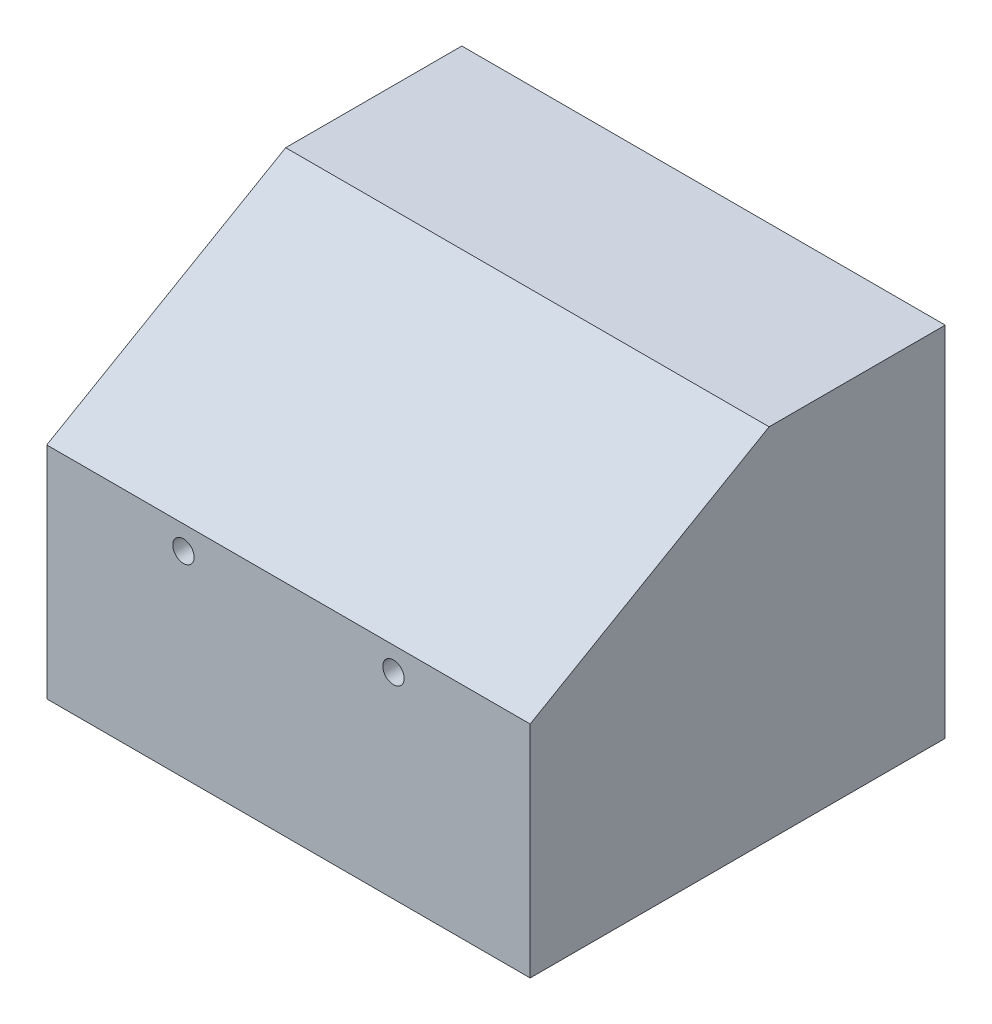
ISO-10303-21;
HEADER;
FILE_DESCRIPTION(('STEP AP214'),'2;1');
FILE_NAME('part.step','',(''),(''),'','','');
FILE_SCHEMA(('AUTOMOTIVE_DESIGN { 1 0 10303 214 1 1 1 1 }'));
ENDSEC;
DATA;
#1=APPLICATION_CONTEXT('core data for automotive mechanical design processes');
#2=APPLICATION_PROTOCOL_DEFINITION('international standard','automotive_design',2000,#1);
#3=PRODUCT_CONTEXT('',#1,'mechanical');
#4=PRODUCT('Part','Part','',(#3));
#5=PRODUCT_RELATED_PRODUCT_CATEGORY('part','',(#4));
#6=PRODUCT_DEFINITION_FORMATION('','',#4);
#7=PRODUCT_DEFINITION_CONTEXT('part definition',#1,'design');
#8=PRODUCT_DEFINITION('design','',#6,#7);
#9=PRODUCT_DEFINITION_SHAPE('','',#8);
#10=(LENGTH_UNIT() NAMED_UNIT(*) SI_UNIT(.MILLI.,.METRE.));
#11=(NAMED_UNIT(*) PLANE_ANGLE_UNIT() SI_UNIT($,.RADIAN.));
#12=(NAMED_UNIT(*) SI_UNIT($,.STERADIAN.) SOLID_ANGLE_UNIT());
#13=UNCERTAINTY_MEASURE_WITH_UNIT(LENGTH_MEASURE(1.E-05),#10,'distance_accuracy_value','');
#14=(GEOMETRIC_REPRESENTATION_CONTEXT(3) GLOBAL_UNCERTAINTY_ASSIGNED_CONTEXT((#13)) GLOBAL_UNIT_ASSIGNED_CONTEXT((#10,
#11,#12)) REPRESENTATION_CONTEXT('',''));
#15=CARTESIAN_POINT('',(0.,0.,0.));
#16=DIRECTION('',(0.,0.,1.));
#17=DIRECTION('',(1.,0.,0.));
#18=AXIS2_PLACEMENT_3D('',#15,#16,#17);
#19=CARTESIAN_POINT('',(-97.25,-72.,167.));
#20=DIRECTION('',(1.,0.,0.));
#21=DIRECTION('',(0.,0.,-1.));
#22=AXIS2_PLACEMENT_3D('',#19,#20,#21);
#23=PLANE('',#22);
#24=DIRECTION('',(0.,-1.,0.));
#25=VECTOR('',#24,1.);
#26=CARTESIAN_POINT('',(-97.25,-72.,167.));
#27=LINE('',#26,#25);
#28=CARTESIAN_POINT('',(-97.25,16.5000000000005,167.));
#29=VERTEX_POINT('',#28);
#30=CARTESIAN_POINT('',(-97.25,-72.,167.));
#31=VERTEX_POINT('',#30);
#32=EDGE_CURVE('E93',#29,#31,#27,.T.);
#33=ORIENTED_EDGE('',*,*,#32,.F.);
#34=DIRECTION('',(0.,-0.499999999999995,0.866025403784442));
#35=VECTOR('',#34,1.);
#36=CARTESIAN_POINT('',(-97.25,72.,70.871180179927));
#37=LINE('',#36,#35);
#38=CARTESIAN_POINT('',(-97.25,72.,70.871180179927));
#39=VERTEX_POINT('',#38);
#40=EDGE_CURVE('E46',#39,#29,#37,.T.);
#41=ORIENTED_EDGE('',*,*,#40,.F.);
#42=DIRECTION('',(0.,0.,-1.));
#43=VECTOR('',#42,1.);
#44=CARTESIAN_POINT('',(-97.25,72.,167.));
#45=LINE('',#44,#43);
#46=CARTESIAN_POINT('',(-97.25,72.,0.));
#47=VERTEX_POINT('',#46);
#48=EDGE_CURVE('E74',#39,#47,#45,.T.);
#49=ORIENTED_EDGE('',*,*,#48,.T.);
#50=DIRECTION('',(0.,-1.,0.));
#51=VECTOR('',#50,1.);
#52=CARTESIAN_POINT('',(-97.25,-72.,0.));
#53=LINE('',#52,#51);
#54=CARTESIAN_POINT('',(-97.25,-72.,0.));
#55=VERTEX_POINT('',#54);
#56=EDGE_CURVE('E79',#47,#55,#53,.T.);
#57=ORIENTED_EDGE('',*,*,#56,.T.);
#58=DIRECTION('',(0.,0.,-1.));
#59=VECTOR('',#58,1.);
#60=CARTESIAN_POINT('',(-97.25,-72.,167.));
#61=LINE('',#60,#59);
#62=EDGE_CURVE('E11',#31,#55,#61,.T.);
#63=ORIENTED_EDGE('',*,*,#62,.F.);
#64=EDGE_LOOP('',(#33,#41,#49,#57,#63));
#65=FACE_BOUND('',#64,.T.);
#66=ADVANCED_FACE('F32',(#65),#23,.F.);
#67=CARTESIAN_POINT('',(97.25,-72.,167.));
#68=DIRECTION('',(0.,1.,0.));
#69=DIRECTION('',(-1.,0.,0.));
#70=AXIS2_PLACEMENT_3D('',#67,#68,#69);
#71=PLANE('',#70);
#72=DIRECTION('',(1.,0.,0.));
#73=VECTOR('',#72,1.);
#74=CARTESIAN_POINT('',(97.25,-72.,0.));
#75=LINE('',#74,#73);
#76=CARTESIAN_POINT('',(97.25,-72.,0.));
#77=VERTEX_POINT('',#76);
#78=EDGE_CURVE('E97',#55,#77,#75,.T.);
#79=ORIENTED_EDGE('',*,*,#78,.T.);
#80=DIRECTION('',(0.,0.,-1.));
#81=VECTOR('',#80,1.);
#82=CARTESIAN_POINT('',(97.25,-72.,167.));
#83=LINE('',#82,#81);
#84=CARTESIAN_POINT('',(97.25,-72.,167.));
#85=VERTEX_POINT('',#84);
#86=EDGE_CURVE('E39',#85,#77,#83,.T.);
#87=ORIENTED_EDGE('',*,*,#86,.F.);
#88=DIRECTION('',(1.,0.,0.));
#89=VECTOR('',#88,1.);
#90=CARTESIAN_POINT('',(97.25,-72.,167.));
#91=LINE('',#90,#89);
#92=EDGE_CURVE('E55',#31,#85,#91,.T.);
#93=ORIENTED_EDGE('',*,*,#92,.F.);
#94=ORIENTED_EDGE('',*,*,#62,.T.);
#95=EDGE_LOOP('',(#79,#87,#93,#94));
#96=FACE_BOUND('',#95,.T.);
#97=ADVANCED_FACE('F114',(#96),#71,.F.);
#98=CARTESIAN_POINT('',(97.25,-72.,167.));
#99=DIRECTION('',(-1.,0.,0.));
#100=DIRECTION('',(0.,0.,1.));
#101=AXIS2_PLACEMENT_3D('',#98,#99,#100);
#102=PLANE('',#101);
#103=DIRECTION('',(0.,0.,-1.));
#104=VECTOR('',#103,1.);
#105=CARTESIAN_POINT('',(97.25,72.,167.));
#106=LINE('',#105,#104);
#107=CARTESIAN_POINT('',(97.25,72.,70.871180179927));
#108=VERTEX_POINT('',#107);
#109=CARTESIAN_POINT('',(97.25,72.,0.));
#110=VERTEX_POINT('',#109);
#111=EDGE_CURVE('E83',#108,#110,#106,.T.);
#112=ORIENTED_EDGE('',*,*,#111,.F.);
#113=DIRECTION('',(0.,-0.499999999999995,0.866025403784442));
#114=VECTOR('',#113,1.);
#115=CARTESIAN_POINT('',(97.25,72.,70.871180179927));
#116=LINE('',#115,#114);
#117=CARTESIAN_POINT('',(97.25,16.5000000000005,167.));
#118=VERTEX_POINT('',#117);
#119=EDGE_CURVE('E140',#108,#118,#116,.T.);
#120=ORIENTED_EDGE('',*,*,#119,.T.);
#121=DIRECTION('',(0.,1.,0.));
#122=VECTOR('',#121,1.);
#123=CARTESIAN_POINT('',(97.25,-72.,167.));
#124=LINE('',#123,#122);
#125=EDGE_CURVE('E84',#85,#118,#124,.T.);
#126=ORIENTED_EDGE('',*,*,#125,.F.);
#127=ORIENTED_EDGE('',*,*,#86,.T.);
#128=DIRECTION('',(0.,1.,0.));
#129=VECTOR('',#128,1.);
#130=CARTESIAN_POINT('',(97.25,-72.,0.));
#131=LINE('',#130,#129);
#132=EDGE_CURVE('E94',#77,#110,#131,.T.);
#133=ORIENTED_EDGE('',*,*,#132,.T.);
#134=EDGE_LOOP('',(#112,#120,#126,#127,#133));
#135=FACE_BOUND('',#134,.T.);
#136=ADVANCED_FACE('F111',(#135),#102,.F.);
#137=CARTESIAN_POINT('',(97.25,72.,167.));
#138=DIRECTION('',(0.,-1.,0.));
#139=DIRECTION('',(1.,0.,0.));
#140=AXIS2_PLACEMENT_3D('',#137,#138,#139);
#141=PLANE('',#140);
#142=ORIENTED_EDGE('',*,*,#48,.F.);
#143=DIRECTION('',(-1.,0.,0.));
#144=VECTOR('',#143,1.);
#145=CARTESIAN_POINT('',(97.25,72.,70.871180179927));
#146=LINE('',#145,#144);
#147=EDGE_CURVE('E138',#108,#39,#146,.T.);
#148=ORIENTED_EDGE('',*,*,#147,.F.);
#149=ORIENTED_EDGE('',*,*,#111,.T.);
#150=DIRECTION('',(-1.,0.,0.));
#151=VECTOR('',#150,1.);
#152=CARTESIAN_POINT('',(97.25,72.,0.));
#153=LINE('',#152,#151);
#154=EDGE_CURVE('E87',#110,#47,#153,.T.);
#155=ORIENTED_EDGE('',*,*,#154,.T.);
#156=EDGE_LOOP('',(#142,#148,#149,#155));
#157=FACE_BOUND('',#156,.T.);
#158=ADVANCED_FACE('F88',(#157),#141,.F.);
#159=CARTESIAN_POINT('',(0.,0.,167.));
#160=DIRECTION('',(0.,0.,1.));
#161=DIRECTION('',(1.,0.,0.));
#162=AXIS2_PLACEMENT_3D('',#159,#160,#161);
#163=PLANE('',#162);
#164=DIRECTION('',(-1.,0.,0.));
#165=VECTOR('',#164,1.);
#166=CARTESIAN_POINT('',(97.25,16.5000000000005,167.));
#167=LINE('',#166,#165);
#168=EDGE_CURVE('E137',#118,#29,#167,.T.);
#169=ORIENTED_EDGE('',*,*,#168,.T.);
#170=ORIENTED_EDGE('',*,*,#32,.T.);
#171=ORIENTED_EDGE('',*,*,#92,.T.);
#172=ORIENTED_EDGE('',*,*,#125,.T.);
#173=EDGE_LOOP('',(#169,#170,#171,#172));
#174=FACE_BOUND('',#173,.T.);
#175=CARTESIAN_POINT('',(42.25,7.00000000000001,167.));
#176=DIRECTION('',(0.,0.,1.));
#177=DIRECTION('',(1.,0.,0.));
#178=AXIS2_PLACEMENT_3D('',#175,#176,#177);
#179=CIRCLE('',#178,4.29999999999999);
#180=CARTESIAN_POINT('',(46.55,7.00000000000001,167.));
#181=VERTEX_POINT('',#180);
#182=EDGE_CURVE('E134',#181,#181,#179,.T.);
#183=ORIENTED_EDGE('',*,*,#182,.F.);
#184=EDGE_LOOP('',(#183));
#185=FACE_BOUND('',#184,.T.);
#186=CARTESIAN_POINT('',(-42.25,7.00000000000001,167.));
#187=DIRECTION('',(0.,0.,1.));
#188=DIRECTION('',(1.,0.,0.));
#189=AXIS2_PLACEMENT_3D('',#186,#187,#188);
#190=CIRCLE('',#189,4.29999999999999);
#191=CARTESIAN_POINT('',(-37.95,7.00000000000001,167.));
#192=VERTEX_POINT('',#191);
#193=EDGE_CURVE('E122',#192,#192,#190,.T.);
#194=ORIENTED_EDGE('',*,*,#193,.F.);
#195=EDGE_LOOP('',(#194));
#196=FACE_BOUND('',#195,.T.);
#197=ADVANCED_FACE('F146',(#174,#185,#196),#163,.T.);
#198=CARTESIAN_POINT('',(0.,0.,0.));
#199=DIRECTION('',(0.,0.,1.));
#200=DIRECTION('',(1.,0.,0.));
#201=AXIS2_PLACEMENT_3D('',#198,#199,#200);
#202=PLANE('',#201);
#203=CARTESIAN_POINT('',(42.25,7.00000000000001,0.));
#204=DIRECTION('',(0.,0.,1.));
#205=DIRECTION('',(1.,0.,0.));
#206=AXIS2_PLACEMENT_3D('',#203,#204,#205);
#207=CIRCLE('',#206,2.24999999999997);
#208=CARTESIAN_POINT('',(44.5,7.00000000000001,0.));
#209=VERTEX_POINT('',#208);
#210=EDGE_CURVE('E125',#209,#209,#207,.T.);
#211=ORIENTED_EDGE('',*,*,#210,.T.);
#212=EDGE_LOOP('',(#211));
#213=FACE_BOUND('',#212,.T.);
#214=CARTESIAN_POINT('',(-42.25,7.00000000000001,0.));
#215=DIRECTION('',(0.,0.,1.));
#216=DIRECTION('',(1.,0.,0.));
#217=AXIS2_PLACEMENT_3D('',#214,#215,#216);
#218=CIRCLE('',#217,2.24999999999997);
#219=CARTESIAN_POINT('',(-40.,7.00000000000001,0.));
#220=VERTEX_POINT('',#219);
#221=EDGE_CURVE('E98',#220,#220,#218,.T.);
#222=ORIENTED_EDGE('',*,*,#221,.T.);
#223=EDGE_LOOP('',(#222));
#224=FACE_BOUND('',#223,.T.);
#225=ORIENTED_EDGE('',*,*,#56,.F.);
#226=ORIENTED_EDGE('',*,*,#154,.F.);
#227=ORIENTED_EDGE('',*,*,#132,.F.);
#228=ORIENTED_EDGE('',*,*,#78,.F.);
#229=EDGE_LOOP('',(#225,#226,#227,#228));
#230=FACE_BOUND('',#229,.T.);
#231=ADVANCED_FACE('F96',(#213,#224,#230),#202,.F.);
#232=CARTESIAN_POINT('',(-42.25,7.00000000000001,167.));
#233=DIRECTION('',(0.,0.,1.));
#234=DIRECTION('',(1.,0.,0.));
#235=AXIS2_PLACEMENT_3D('',#232,#233,#234);
#236=CYLINDRICAL_SURFACE('',#235,2.24999999999997);
#237=ORIENTED_EDGE('',*,*,#221,.F.);
#238=EDGE_LOOP('',(#237));
#239=FACE_BOUND('',#238,.T.);
#240=CARTESIAN_POINT('',(-42.25,7.00000000000001,5.));
#241=DIRECTION('',(0.,0.,1.));
#242=DIRECTION('',(1.,0.,0.));
#243=AXIS2_PLACEMENT_3D('',#240,#241,#242);
#244=CIRCLE('',#243,2.24999999999997);
#245=CARTESIAN_POINT('',(-40.,7.00000000000001,5.));
#246=VERTEX_POINT('',#245);
#247=EDGE_CURVE('E102',#246,#246,#244,.T.);
#248=ORIENTED_EDGE('',*,*,#247,.T.);
#249=EDGE_LOOP('',(#248));
#250=FACE_BOUND('',#249,.T.);
#251=ADVANCED_FACE('F171',(#239,#250),#236,.F.);
#252=CARTESIAN_POINT('',(-40.,7.00000000000001,5.));
#253=DIRECTION('',(0.,0.,-1.));
#254=DIRECTION('',(-1.,0.,0.));
#255=AXIS2_PLACEMENT_3D('',#252,#253,#254);
#256=PLANE('',#255);
#257=ORIENTED_EDGE('',*,*,#247,.F.);
#258=EDGE_LOOP('',(#257));
#259=FACE_BOUND('',#258,.T.);
#260=CARTESIAN_POINT('',(-42.25,7.00000000000001,5.));
#261=DIRECTION('',(0.,0.,1.));
#262=DIRECTION('',(1.,0.,0.));
#263=AXIS2_PLACEMENT_3D('',#260,#261,#262);
#264=CIRCLE('',#263,4.29999999999996);
#265=CARTESIAN_POINT('',(-37.95,7.00000000000001,5.));
#266=VERTEX_POINT('',#265);
#267=EDGE_CURVE('E119',#266,#266,#264,.T.);
#268=ORIENTED_EDGE('',*,*,#267,.T.);
#269=EDGE_LOOP('',(#268));
#270=FACE_BOUND('',#269,.T.);
#271=ADVANCED_FACE('F177',(#259,#270),#256,.F.);
#272=CARTESIAN_POINT('',(-42.25,7.00000000000001,167.));
#273=DIRECTION('',(0.,0.,1.));
#274=DIRECTION('',(1.,0.,0.));
#275=AXIS2_PLACEMENT_3D('',#272,#273,#274);
#276=CYLINDRICAL_SURFACE('',#275,4.29999999999997);
#277=ORIENTED_EDGE('',*,*,#267,.F.);
#278=EDGE_LOOP('',(#277));
#279=FACE_BOUND('',#278,.T.);
#280=ORIENTED_EDGE('',*,*,#193,.T.);
#281=EDGE_LOOP('',(#280));
#282=FACE_BOUND('',#281,.T.);
#283=ADVANCED_FACE('F181',(#279,#282),#276,.F.);
#284=CARTESIAN_POINT('',(42.25,7.00000000000001,167.));
#285=DIRECTION('',(0.,0.,1.));
#286=DIRECTION('',(1.,0.,0.));
#287=AXIS2_PLACEMENT_3D('',#284,#285,#286);
#288=CYLINDRICAL_SURFACE('',#287,2.24999999999997);
#289=ORIENTED_EDGE('',*,*,#210,.F.);
#290=EDGE_LOOP('',(#289));
#291=FACE_BOUND('',#290,.T.);
#292=CARTESIAN_POINT('',(42.25,7.00000000000001,5.));
#293=DIRECTION('',(0.,0.,1.));
#294=DIRECTION('',(1.,0.,0.));
#295=AXIS2_PLACEMENT_3D('',#292,#293,#294);
#296=CIRCLE('',#295,2.24999999999997);
#297=CARTESIAN_POINT('',(44.5,7.00000000000001,5.));
#298=VERTEX_POINT('',#297);
#299=EDGE_CURVE('E128',#298,#298,#296,.T.);
#300=ORIENTED_EDGE('',*,*,#299,.T.);
#301=EDGE_LOOP('',(#300));
#302=FACE_BOUND('',#301,.T.);
#303=ADVANCED_FACE('F185',(#291,#302),#288,.F.);
#304=CARTESIAN_POINT('',(44.5,7.00000000000001,5.));
#305=DIRECTION('',(0.,0.,-1.));
#306=DIRECTION('',(-1.,0.,0.));
#307=AXIS2_PLACEMENT_3D('',#304,#305,#306);
#308=PLANE('',#307);
#309=ORIENTED_EDGE('',*,*,#299,.F.);
#310=EDGE_LOOP('',(#309));
#311=FACE_BOUND('',#310,.T.);
#312=CARTESIAN_POINT('',(42.25,7.00000000000001,5.));
#313=DIRECTION('',(0.,0.,1.));
#314=DIRECTION('',(1.,0.,0.));
#315=AXIS2_PLACEMENT_3D('',#312,#313,#314);
#316=CIRCLE('',#315,4.29999999999996);
#317=CARTESIAN_POINT('',(46.55,7.00000000000001,5.));
#318=VERTEX_POINT('',#317);
#319=EDGE_CURVE('E131',#318,#318,#316,.T.);
#320=ORIENTED_EDGE('',*,*,#319,.T.);
#321=EDGE_LOOP('',(#320));
#322=FACE_BOUND('',#321,.T.);
#323=ADVANCED_FACE('F155',(#311,#322),#308,.F.);
#324=CARTESIAN_POINT('',(42.25,7.00000000000001,167.));
#325=DIRECTION('',(0.,0.,1.));
#326=DIRECTION('',(1.,0.,0.));
#327=AXIS2_PLACEMENT_3D('',#324,#325,#326);
#328=CYLINDRICAL_SURFACE('',#327,4.29999999999997);
#329=ORIENTED_EDGE('',*,*,#319,.F.);
#330=EDGE_LOOP('',(#329));
#331=FACE_BOUND('',#330,.T.);
#332=ORIENTED_EDGE('',*,*,#182,.T.);
#333=EDGE_LOOP('',(#332));
#334=FACE_BOUND('',#333,.T.);
#335=ADVANCED_FACE('F150',(#331,#334),#328,.F.);
#336=CARTESIAN_POINT('',(97.25,72.,70.871180179927));
#337=DIRECTION('',(0.,-0.866025403784442,-0.499999999999995));
#338=DIRECTION('',(0.,0.499999999999995,-0.866025403784442));
#339=AXIS2_PLACEMENT_3D('',#336,#337,#338);
#340=PLANE('',#339);
#341=ORIENTED_EDGE('',*,*,#40,.T.);
#342=ORIENTED_EDGE('',*,*,#168,.F.);
#343=ORIENTED_EDGE('',*,*,#119,.F.);
#344=ORIENTED_EDGE('',*,*,#147,.T.);
#345=EDGE_LOOP('',(#341,#342,#343,#344));
#346=FACE_BOUND('',#345,.T.);
#347=ADVANCED_FACE('F148',(#346),#340,.F.);
#348=CLOSED_SHELL('',(#66,#97,#136,#158,#197,#231,#251,#271,#283,#303,#323,#335,#347));
#349=MANIFOLD_SOLID_BREP('B2',#348);
#350=ADVANCED_BREP_SHAPE_REPRESENTATION('',(#18,#349),#14);
#351=SHAPE_DEFINITION_REPRESENTATION(#9,#350);
ENDSEC;
END-ISO-10303-21;
